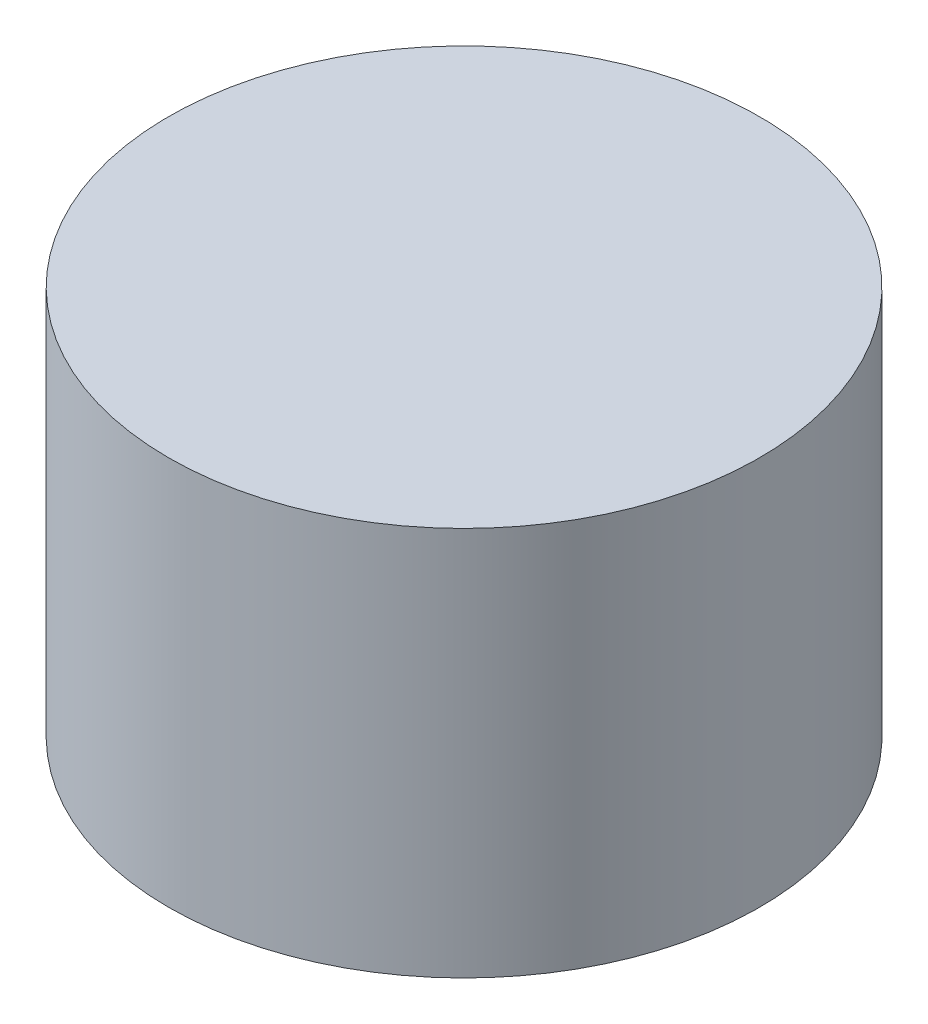
ISO-10303-21;
HEADER;
FILE_DESCRIPTION(('STEP AP214'),'2;1');
FILE_NAME('part.step','',(''),(''),'','','');
FILE_SCHEMA(('AUTOMOTIVE_DESIGN { 1 0 10303 214 1 1 1 1 }'));
ENDSEC;
DATA;
#1=APPLICATION_CONTEXT('core data for automotive mechanical design processes');
#2=APPLICATION_PROTOCOL_DEFINITION('international standard','automotive_design',2000,#1);
#3=PRODUCT_CONTEXT('',#1,'mechanical');
#4=PRODUCT('Part','Part','',(#3));
#5=PRODUCT_RELATED_PRODUCT_CATEGORY('part','',(#4));
#6=PRODUCT_DEFINITION_FORMATION('','',#4);
#7=PRODUCT_DEFINITION_CONTEXT('part definition',#1,'design');
#8=PRODUCT_DEFINITION('design','',#6,#7);
#9=PRODUCT_DEFINITION_SHAPE('','',#8);
#10=(LENGTH_UNIT() NAMED_UNIT(*) SI_UNIT(.MILLI.,.METRE.));
#11=(NAMED_UNIT(*) PLANE_ANGLE_UNIT() SI_UNIT($,.RADIAN.));
#12=(NAMED_UNIT(*) SI_UNIT($,.STERADIAN.) SOLID_ANGLE_UNIT());
#13=UNCERTAINTY_MEASURE_WITH_UNIT(LENGTH_MEASURE(1.E-05),#10,'distance_accuracy_value','');
#14=(GEOMETRIC_REPRESENTATION_CONTEXT(3) GLOBAL_UNCERTAINTY_ASSIGNED_CONTEXT((#13)) GLOBAL_UNIT_ASSIGNED_CONTEXT((#10,
#11,#12)) REPRESENTATION_CONTEXT('',''));
#15=CARTESIAN_POINT('',(0.,0.,0.));
#16=DIRECTION('',(0.,0.,1.));
#17=DIRECTION('',(1.,0.,0.));
#18=AXIS2_PLACEMENT_3D('',#15,#16,#17);
#19=CARTESIAN_POINT('',(0.,50.8,0.));
#20=DIRECTION('',(0.,-1.,0.));
#21=DIRECTION('',(0.,0.,-1.));
#22=AXIS2_PLACEMENT_3D('',#19,#20,#21);
#23=CYLINDRICAL_SURFACE('',#22,38.5561843981905);
#24=CARTESIAN_POINT('',(0.,50.8,0.));
#25=DIRECTION('',(0.,1.,0.));
#26=DIRECTION('',(0.,0.,1.));
#27=AXIS2_PLACEMENT_3D('',#24,#25,#26);
#28=CIRCLE('',#27,38.5561843981905);
#29=CARTESIAN_POINT('',(0.,50.8,38.5561843981905));
#30=VERTEX_POINT('',#29);
#31=EDGE_CURVE('E10',#30,#30,#28,.T.);
#32=ORIENTED_EDGE('',*,*,#31,.F.);
#33=EDGE_LOOP('',(#32));
#34=FACE_BOUND('',#33,.T.);
#35=CARTESIAN_POINT('',(0.,0.,0.));
#36=DIRECTION('',(0.,1.,0.));
#37=DIRECTION('',(0.,0.,1.));
#38=AXIS2_PLACEMENT_3D('',#35,#36,#37);
#39=CIRCLE('',#38,38.5561843981905);
#40=CARTESIAN_POINT('',(0.,0.,38.5561843981905));
#41=VERTEX_POINT('',#40);
#42=EDGE_CURVE('E46',#41,#41,#39,.T.);
#43=ORIENTED_EDGE('',*,*,#42,.T.);
#44=EDGE_LOOP('',(#43));
#45=FACE_BOUND('',#44,.T.);
#46=ADVANCED_FACE('F43',(#34,#45),#23,.T.);
#47=CARTESIAN_POINT('',(0.,50.8,0.));
#48=DIRECTION('',(0.,1.,0.));
#49=DIRECTION('',(0.,0.,1.));
#50=AXIS2_PLACEMENT_3D('',#47,#48,#49);
#51=PLANE('',#50);
#52=ORIENTED_EDGE('',*,*,#31,.T.);
#53=EDGE_LOOP('',(#52));
#54=FACE_BOUND('',#53,.T.);
#55=ADVANCED_FACE('F60',(#54),#51,.T.);
#56=CARTESIAN_POINT('',(0.,0.,0.));
#57=DIRECTION('',(0.,1.,0.));
#58=DIRECTION('',(0.,0.,1.));
#59=AXIS2_PLACEMENT_3D('',#56,#57,#58);
#60=PLANE('',#59);
#61=ORIENTED_EDGE('',*,*,#42,.F.);
#62=EDGE_LOOP('',(#61));
#63=FACE_BOUND('',#62,.T.);
#64=ADVANCED_FACE('F58',(#63),#60,.F.);
#65=CLOSED_SHELL('',(#46,#55,#64));
#66=MANIFOLD_SOLID_BREP('B2',#65);
#67=ADVANCED_BREP_SHAPE_REPRESENTATION('',(#18,#66),#14);
#68=SHAPE_DEFINITION_REPRESENTATION(#9,#67);
ENDSEC;
END-ISO-10303-21;
